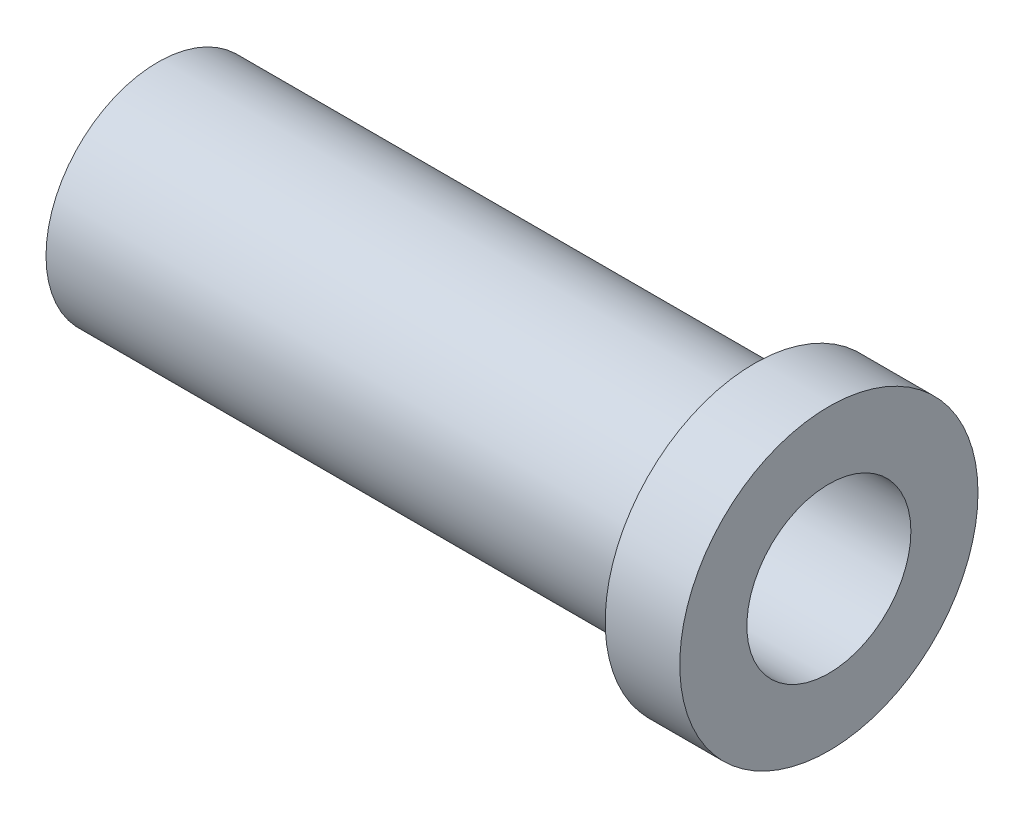
ISO-10303-21;
HEADER;
FILE_DESCRIPTION(('STEP AP214'),'2;1');
FILE_NAME('part.step','',(''),(''),'','','');
FILE_SCHEMA(('AUTOMOTIVE_DESIGN { 1 0 10303 214 1 1 1 1 }'));
ENDSEC;
DATA;
#1=APPLICATION_CONTEXT('core data for automotive mechanical design processes');
#2=APPLICATION_PROTOCOL_DEFINITION('international standard','automotive_design',2000,#1);
#3=PRODUCT_CONTEXT('',#1,'mechanical');
#4=PRODUCT('Part','Part','',(#3));
#5=PRODUCT_RELATED_PRODUCT_CATEGORY('part','',(#4));
#6=PRODUCT_DEFINITION_FORMATION('','',#4);
#7=PRODUCT_DEFINITION_CONTEXT('part definition',#1,'design');
#8=PRODUCT_DEFINITION('design','',#6,#7);
#9=PRODUCT_DEFINITION_SHAPE('','',#8);
#10=(LENGTH_UNIT() NAMED_UNIT(*) SI_UNIT(.MILLI.,.METRE.));
#11=(NAMED_UNIT(*) PLANE_ANGLE_UNIT() SI_UNIT($,.RADIAN.));
#12=(NAMED_UNIT(*) SI_UNIT($,.STERADIAN.) SOLID_ANGLE_UNIT());
#13=UNCERTAINTY_MEASURE_WITH_UNIT(LENGTH_MEASURE(1.E-05),#10,'distance_accuracy_value','');
#14=(GEOMETRIC_REPRESENTATION_CONTEXT(3) GLOBAL_UNCERTAINTY_ASSIGNED_CONTEXT((#13)) GLOBAL_UNIT_ASSIGNED_CONTEXT((#10,
#11,#12)) REPRESENTATION_CONTEXT('',''));
#15=CARTESIAN_POINT('',(0.,0.,0.));
#16=DIRECTION('',(0.,0.,1.));
#17=DIRECTION('',(1.,0.,0.));
#18=AXIS2_PLACEMENT_3D('',#15,#16,#17);
#19=CARTESIAN_POINT('',(5.,0.,0.));
#20=DIRECTION('',(-1.,0.,0.));
#21=DIRECTION('',(0.,0.,1.));
#22=AXIS2_PLACEMENT_3D('',#19,#20,#21);
#23=CYLINDRICAL_SURFACE('',#22,10.);
#24=CARTESIAN_POINT('',(5.,0.,0.));
#25=DIRECTION('',(1.,0.,0.));
#26=DIRECTION('',(0.,0.,-1.));
#27=AXIS2_PLACEMENT_3D('',#24,#25,#26);
#28=CIRCLE('',#27,10.);
#29=CARTESIAN_POINT('',(5.,0.,-10.));
#30=VERTEX_POINT('',#29);
#31=EDGE_CURVE('E42',#30,#30,#28,.T.);
#32=ORIENTED_EDGE('',*,*,#31,.F.);
#33=EDGE_LOOP('',(#32));
#34=FACE_BOUND('',#33,.T.);
#35=CARTESIAN_POINT('',(0.,0.,0.));
#36=DIRECTION('',(1.,0.,0.));
#37=DIRECTION('',(0.,0.,-1.));
#38=AXIS2_PLACEMENT_3D('',#35,#36,#37);
#39=CIRCLE('',#38,10.);
#40=CARTESIAN_POINT('',(0.,0.,-10.));
#41=VERTEX_POINT('',#40);
#42=EDGE_CURVE('E38',#41,#41,#39,.T.);
#43=ORIENTED_EDGE('',*,*,#42,.T.);
#44=EDGE_LOOP('',(#43));
#45=FACE_BOUND('',#44,.T.);
#46=ADVANCED_FACE('F35',(#34,#45),#23,.T.);
#47=CARTESIAN_POINT('',(5.,0.,0.));
#48=DIRECTION('',(1.,0.,0.));
#49=DIRECTION('',(0.,0.,-1.));
#50=AXIS2_PLACEMENT_3D('',#47,#48,#49);
#51=PLANE('',#50);
#52=CARTESIAN_POINT('',(5.,0.,0.));
#53=DIRECTION('',(1.,0.,0.));
#54=DIRECTION('',(0.,0.,-1.));
#55=AXIS2_PLACEMENT_3D('',#52,#53,#54);
#56=CIRCLE('',#55,5.5);
#57=CARTESIAN_POINT('',(5.,0.,-5.5));
#58=VERTEX_POINT('',#57);
#59=EDGE_CURVE('E52',#58,#58,#56,.T.);
#60=ORIENTED_EDGE('',*,*,#59,.F.);
#61=EDGE_LOOP('',(#60));
#62=FACE_BOUND('',#61,.T.);
#63=ORIENTED_EDGE('',*,*,#31,.T.);
#64=EDGE_LOOP('',(#63));
#65=FACE_BOUND('',#64,.T.);
#66=ADVANCED_FACE('F67',(#62,#65),#51,.T.);
#67=CARTESIAN_POINT('',(0.,0.,0.));
#68=DIRECTION('',(1.,0.,0.));
#69=DIRECTION('',(0.,0.,-1.));
#70=AXIS2_PLACEMENT_3D('',#67,#68,#69);
#71=PLANE('',#70);
#72=CARTESIAN_POINT('',(0.,0.,0.));
#73=DIRECTION('',(-1.,0.,0.));
#74=DIRECTION('',(0.,0.,1.));
#75=AXIS2_PLACEMENT_3D('',#72,#73,#74);
#76=CIRCLE('',#75,7.5);
#77=CARTESIAN_POINT('',(0.,0.,7.5));
#78=VERTEX_POINT('',#77);
#79=EDGE_CURVE('E10',#78,#78,#76,.T.);
#80=ORIENTED_EDGE('',*,*,#79,.F.);
#81=EDGE_LOOP('',(#80));
#82=FACE_BOUND('',#81,.T.);
#83=ORIENTED_EDGE('',*,*,#42,.F.);
#84=EDGE_LOOP('',(#83));
#85=FACE_BOUND('',#84,.T.);
#86=ADVANCED_FACE('F70',(#82,#85),#71,.F.);
#87=CARTESIAN_POINT('',(-40.,0.,0.));
#88=DIRECTION('',(1.,0.,0.));
#89=DIRECTION('',(0.,0.,-1.));
#90=AXIS2_PLACEMENT_3D('',#87,#88,#89);
#91=CYLINDRICAL_SURFACE('',#90,7.5);
#92=CARTESIAN_POINT('',(-40.,0.,0.));
#93=DIRECTION('',(-1.,0.,0.));
#94=DIRECTION('',(0.,0.,1.));
#95=AXIS2_PLACEMENT_3D('',#92,#93,#94);
#96=CIRCLE('',#95,7.5);
#97=CARTESIAN_POINT('',(-40.,0.,7.5));
#98=VERTEX_POINT('',#97);
#99=EDGE_CURVE('E48',#98,#98,#96,.T.);
#100=ORIENTED_EDGE('',*,*,#99,.F.);
#101=EDGE_LOOP('',(#100));
#102=FACE_BOUND('',#101,.T.);
#103=ORIENTED_EDGE('',*,*,#79,.T.);
#104=EDGE_LOOP('',(#103));
#105=FACE_BOUND('',#104,.T.);
#106=ADVANCED_FACE('F80',(#102,#105),#91,.T.);
#107=CARTESIAN_POINT('',(-40.,0.,0.));
#108=DIRECTION('',(-1.,0.,0.));
#109=DIRECTION('',(0.,0.,1.));
#110=AXIS2_PLACEMENT_3D('',#107,#108,#109);
#111=PLANE('',#110);
#112=CARTESIAN_POINT('',(-40.,0.,0.));
#113=DIRECTION('',(1.,0.,0.));
#114=DIRECTION('',(0.,0.,-1.));
#115=AXIS2_PLACEMENT_3D('',#112,#113,#114);
#116=CIRCLE('',#115,5.5);
#117=CARTESIAN_POINT('',(-40.,0.,-5.5));
#118=VERTEX_POINT('',#117);
#119=EDGE_CURVE('E51',#118,#118,#116,.T.);
#120=ORIENTED_EDGE('',*,*,#119,.T.);
#121=EDGE_LOOP('',(#120));
#122=FACE_BOUND('',#121,.T.);
#123=ORIENTED_EDGE('',*,*,#99,.T.);
#124=EDGE_LOOP('',(#123));
#125=FACE_BOUND('',#124,.T.);
#126=ADVANCED_FACE('F58',(#122,#125),#111,.T.);
#127=CARTESIAN_POINT('',(-40.,0.,0.));
#128=DIRECTION('',(1.,0.,0.));
#129=DIRECTION('',(0.,0.,-1.));
#130=AXIS2_PLACEMENT_3D('',#127,#128,#129);
#131=CYLINDRICAL_SURFACE('',#130,5.5);
#132=CARTESIAN_POINT('',(-40.,0.,-5.5));
#133=CARTESIAN_POINT('',(-39.53125,0.,-5.5));
#134=CARTESIAN_POINT('',(-39.0625,0.,-5.5));
#135=CARTESIAN_POINT('',(-38.125,0.,-5.5));
#136=CARTESIAN_POINT('',(-37.65625,0.,-5.5));
#137=CARTESIAN_POINT('',(-36.71875,0.,-5.5));
#138=CARTESIAN_POINT('',(-36.25,0.,-5.5));
#139=CARTESIAN_POINT('',(-35.3125,0.,-5.5));
#140=CARTESIAN_POINT('',(-34.84375,0.,-5.5));
#141=CARTESIAN_POINT('',(-33.90625,0.,-5.5));
#142=CARTESIAN_POINT('',(-33.4375,0.,-5.5));
#143=CARTESIAN_POINT('',(-32.5,0.,-5.5));
#144=CARTESIAN_POINT('',(-32.03125,0.,-5.5));
#145=CARTESIAN_POINT('',(-31.09375,0.,-5.5));
#146=CARTESIAN_POINT('',(-30.625,0.,-5.5));
#147=CARTESIAN_POINT('',(-29.6875,0.,-5.5));
#148=CARTESIAN_POINT('',(-29.21875,0.,-5.5));
#149=CARTESIAN_POINT('',(-28.28125,0.,-5.5));
#150=CARTESIAN_POINT('',(-27.8125,0.,-5.5));
#151=CARTESIAN_POINT('',(-26.875,0.,-5.5));
#152=CARTESIAN_POINT('',(-26.40625,0.,-5.5));
#153=CARTESIAN_POINT('',(-25.46875,0.,-5.5));
#154=CARTESIAN_POINT('',(-25.,0.,-5.5));
#155=CARTESIAN_POINT('',(-24.0625,0.,-5.5));
#156=CARTESIAN_POINT('',(-23.59375,0.,-5.5));
#157=CARTESIAN_POINT('',(-22.65625,0.,-5.5));
#158=CARTESIAN_POINT('',(-22.1875,0.,-5.5));
#159=CARTESIAN_POINT('',(-21.25,0.,-5.5));
#160=CARTESIAN_POINT('',(-20.78125,0.,-5.5));
#161=CARTESIAN_POINT('',(-19.84375,0.,-5.5));
#162=CARTESIAN_POINT('',(-19.375,0.,-5.5));
#163=CARTESIAN_POINT('',(-18.4375,0.,-5.5));
#164=CARTESIAN_POINT('',(-17.96875,0.,-5.5));
#165=CARTESIAN_POINT('',(-17.03125,0.,-5.5));
#166=CARTESIAN_POINT('',(-16.5625,0.,-5.5));
#167=CARTESIAN_POINT('',(-15.625,0.,-5.5));
#168=CARTESIAN_POINT('',(-15.15625,0.,-5.5));
#169=CARTESIAN_POINT('',(-14.21875,0.,-5.5));
#170=CARTESIAN_POINT('',(-13.75,0.,-5.5));
#171=CARTESIAN_POINT('',(-12.8125,0.,-5.5));
#172=CARTESIAN_POINT('',(-12.34375,0.,-5.5));
#173=CARTESIAN_POINT('',(-11.40625,0.,-5.5));
#174=CARTESIAN_POINT('',(-10.9375,0.,-5.5));
#175=CARTESIAN_POINT('',(-9.99999999999999,0.,-5.5));
#176=CARTESIAN_POINT('',(-9.53124999999999,0.,-5.5));
#177=CARTESIAN_POINT('',(-8.59375,0.,-5.5));
#178=CARTESIAN_POINT('',(-8.125,0.,-5.5));
#179=CARTESIAN_POINT('',(-7.1875,0.,-5.5));
#180=CARTESIAN_POINT('',(-6.71875,0.,-5.5));
#181=CARTESIAN_POINT('',(-5.78125,0.,-5.5));
#182=CARTESIAN_POINT('',(-5.3125,0.,-5.5));
#183=CARTESIAN_POINT('',(-4.375,0.,-5.5));
#184=CARTESIAN_POINT('',(-3.90625,0.,-5.5));
#185=CARTESIAN_POINT('',(-2.96875,0.,-5.5));
#186=CARTESIAN_POINT('',(-2.5,0.,-5.5));
#187=CARTESIAN_POINT('',(-1.5625,0.,-5.5));
#188=CARTESIAN_POINT('',(-1.09375,0.,-5.5));
#189=CARTESIAN_POINT('',(-0.156249999999999,0.,-5.5));
#190=CARTESIAN_POINT('',(0.312500000000003,0.,-5.5));
#191=CARTESIAN_POINT('',(1.25,0.,-5.5));
#192=CARTESIAN_POINT('',(1.71875,0.,-5.5));
#193=CARTESIAN_POINT('',(2.65625,0.,-5.5));
#194=CARTESIAN_POINT('',(3.12500000000001,0.,-5.5));
#195=CARTESIAN_POINT('',(4.06250000000001,0.,-5.5));
#196=CARTESIAN_POINT('',(4.53125000000001,0.,-5.5));
#197=CARTESIAN_POINT('',(5.,0.,-5.5));
#198=B_SPLINE_CURVE_WITH_KNOTS('',3,(#132,#133,#134,#135,#136,#137,#138,#139,#140,#141,#142,
#143,#144,#145,#146,#147,#148,#149,#150,#151,#152,#153,#154,#155,#156,#157,#158,#159,#160,#161,
#162,#163,#164,#165,#166,#167,#168,#169,#170,#171,#172,#173,#174,#175,#176,#177,#178,#179,#180,
#181,#182,#183,#184,#185,#186,#187,#188,#189,#190,#191,#192,#193,#194,#195,#196,#197),
.UNSPECIFIED.,.F.,.F.,(4,2,2,2,2,2,2,2,2,2,2,2,2,2,2,2,2,2,2,2,2,2,2,2,2,2,2,2,2,2,2,2,4),(0.,
1.40625,2.8125,4.21875000000001,5.62500000000001,7.03125,8.43750000000001,9.84375000000001,
11.25,12.65625,14.0625,15.46875,16.875,18.28125,19.6875,21.09375,22.5,23.90625,25.3125,26.71875,
28.125,29.53125,30.9375,32.34375,33.75,35.15625,36.5625,37.96875,39.375,40.78125,42.1875,
43.59375,45.),.UNSPECIFIED.);
#199=EDGE_CURVE('BSEAM61',#118,#58,#198,.T.);
#200=ORIENTED_EDGE('',*,*,#119,.F.);
#201=ORIENTED_EDGE('',*,*,#59,.T.);
#202=ORIENTED_EDGE('',*,*,#199,.T.);
#203=ORIENTED_EDGE('',*,*,#199,.F.);
#204=EDGE_LOOP('',(#200,#202,#201,#203));
#205=FACE_BOUND('',#204,.T.);
#206=ADVANCED_FACE('F61',(#205),#131,.F.);
#207=CLOSED_SHELL('',(#46,#66,#86,#106,#126,#206));
#208=MANIFOLD_SOLID_BREP('B2',#207);
#209=ADVANCED_BREP_SHAPE_REPRESENTATION('',(#18,#208),#14);
#210=SHAPE_DEFINITION_REPRESENTATION(#9,#209);
ENDSEC;
END-ISO-10303-21;
